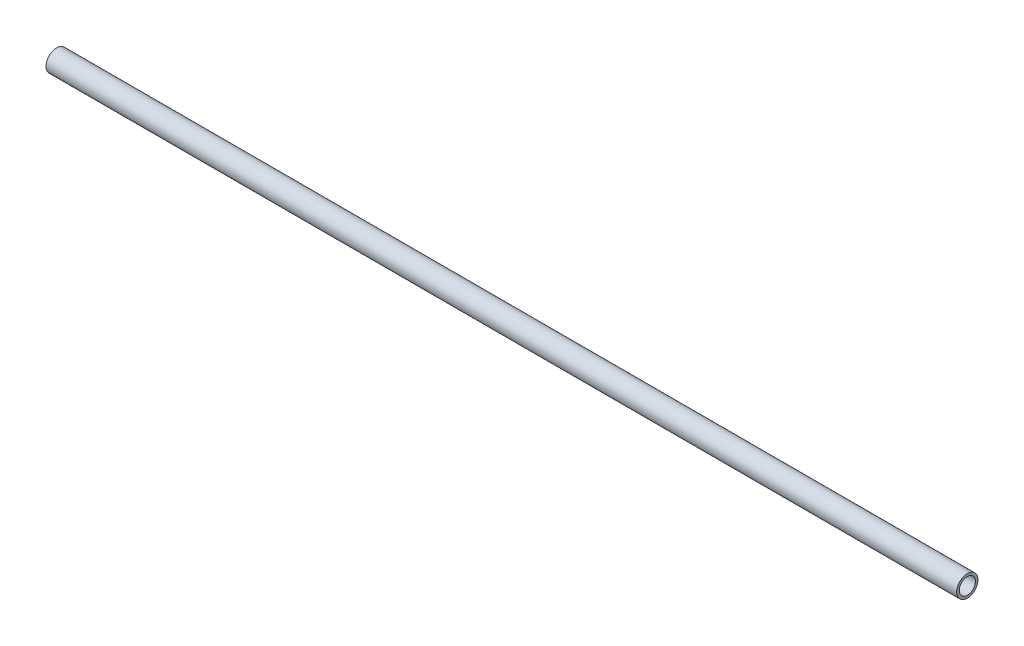
ISO-10303-21;
HEADER;
FILE_DESCRIPTION(('STEP AP214'),'2;1');
FILE_NAME('part.step','',(''),(''),'','','');
FILE_SCHEMA(('AUTOMOTIVE_DESIGN { 1 0 10303 214 1 1 1 1 }'));
ENDSEC;
DATA;
#1=APPLICATION_CONTEXT('core data for automotive mechanical design processes');
#2=APPLICATION_PROTOCOL_DEFINITION('international standard','automotive_design',2000,#1);
#3=PRODUCT_CONTEXT('',#1,'mechanical');
#4=PRODUCT('Part','Part','',(#3));
#5=PRODUCT_RELATED_PRODUCT_CATEGORY('part','',(#4));
#6=PRODUCT_DEFINITION_FORMATION('','',#4);
#7=PRODUCT_DEFINITION_CONTEXT('part definition',#1,'design');
#8=PRODUCT_DEFINITION('design','',#6,#7);
#9=PRODUCT_DEFINITION_SHAPE('','',#8);
#10=(LENGTH_UNIT() NAMED_UNIT(*) SI_UNIT(.MILLI.,.METRE.));
#11=(NAMED_UNIT(*) PLANE_ANGLE_UNIT() SI_UNIT($,.RADIAN.));
#12=(NAMED_UNIT(*) SI_UNIT($,.STERADIAN.) SOLID_ANGLE_UNIT());
#13=UNCERTAINTY_MEASURE_WITH_UNIT(LENGTH_MEASURE(1.E-05),#10,'distance_accuracy_value','');
#14=(GEOMETRIC_REPRESENTATION_CONTEXT(3) GLOBAL_UNCERTAINTY_ASSIGNED_CONTEXT((#13)) GLOBAL_UNIT_ASSIGNED_CONTEXT((#10,
#11,#12)) REPRESENTATION_CONTEXT('',''));
#15=CARTESIAN_POINT('',(0.,0.,0.));
#16=DIRECTION('',(0.,0.,1.));
#17=DIRECTION('',(1.,0.,0.));
#18=AXIS2_PLACEMENT_3D('',#15,#16,#17);
#19=CARTESIAN_POINT('',(90.,0.,0.));
#20=DIRECTION('',(1.,0.,0.));
#21=DIRECTION('',(0.,0.,-1.));
#22=AXIS2_PLACEMENT_3D('',#19,#20,#21);
#23=PLANE('',#22);
#24=CARTESIAN_POINT('',(90.,0.,0.));
#25=DIRECTION('',(1.,0.,0.));
#26=DIRECTION('',(0.,0.,-1.));
#27=AXIS2_PLACEMENT_3D('',#24,#25,#26);
#28=CIRCLE('',#27,1.0541);
#29=CARTESIAN_POINT('',(90.,0.,-1.0541));
#30=VERTEX_POINT('',#29);
#31=EDGE_CURVE('E10',#30,#30,#28,.T.);
#32=ORIENTED_EDGE('',*,*,#31,.T.);
#33=EDGE_LOOP('',(#32));
#34=FACE_BOUND('',#33,.T.);
#35=CARTESIAN_POINT('',(90.,0.,0.));
#36=DIRECTION('',(1.,0.,0.));
#37=DIRECTION('',(0.,0.,-1.));
#38=AXIS2_PLACEMENT_3D('',#35,#36,#37);
#39=CIRCLE('',#38,0.8001);
#40=CARTESIAN_POINT('',(90.,0.,-0.8001));
#41=VERTEX_POINT('',#40);
#42=EDGE_CURVE('E48',#41,#41,#39,.T.);
#43=ORIENTED_EDGE('',*,*,#42,.F.);
#44=EDGE_LOOP('',(#43));
#45=FACE_BOUND('',#44,.T.);
#46=ADVANCED_FACE('F30',(#34,#45),#23,.T.);
#47=CARTESIAN_POINT('',(0.,0.,0.));
#48=DIRECTION('',(1.,0.,0.));
#49=DIRECTION('',(0.,0.,-1.));
#50=AXIS2_PLACEMENT_3D('',#47,#48,#49);
#51=PLANE('',#50);
#52=CARTESIAN_POINT('',(0.,0.,0.));
#53=DIRECTION('',(1.,0.,0.));
#54=DIRECTION('',(0.,0.,-1.));
#55=AXIS2_PLACEMENT_3D('',#52,#53,#54);
#56=CIRCLE('',#55,1.0541);
#57=CARTESIAN_POINT('',(0.,0.,-1.0541));
#58=VERTEX_POINT('',#57);
#59=EDGE_CURVE('E43',#58,#58,#56,.T.);
#60=ORIENTED_EDGE('',*,*,#59,.F.);
#61=EDGE_LOOP('',(#60));
#62=FACE_BOUND('',#61,.T.);
#63=CARTESIAN_POINT('',(0.,0.,0.));
#64=DIRECTION('',(1.,0.,0.));
#65=DIRECTION('',(0.,0.,-1.));
#66=AXIS2_PLACEMENT_3D('',#63,#64,#65);
#67=CIRCLE('',#66,0.8001);
#68=CARTESIAN_POINT('',(0.,0.,-0.8001));
#69=VERTEX_POINT('',#68);
#70=EDGE_CURVE('E50',#69,#69,#67,.T.);
#71=ORIENTED_EDGE('',*,*,#70,.T.);
#72=EDGE_LOOP('',(#71));
#73=FACE_BOUND('',#72,.T.);
#74=ADVANCED_FACE('F70',(#62,#73),#51,.F.);
#75=CARTESIAN_POINT('',(90.,0.,0.));
#76=DIRECTION('',(-1.,0.,0.));
#77=DIRECTION('',(0.,0.,1.));
#78=AXIS2_PLACEMENT_3D('',#75,#76,#77);
#79=CYLINDRICAL_SURFACE('',#78,1.0541);
#80=CARTESIAN_POINT('',(1.19548603606049,0.,-1.0541));
#81=CARTESIAN_POINT('',(1.19548683350998,0.0214873132577128,-1.05410059922096));
#82=CARTESIAN_POINT('',(1.19373556685014,0.0429691878740783,-1.05343728470627));
#83=CARTESIAN_POINT('',(1.18680539809992,0.0852906058644149,-1.0508575295686));
#84=CARTESIAN_POINT('',(1.18162702005604,0.106130246933803,-1.0489412805349));
#85=CARTESIAN_POINT('',(1.16805195915469,0.146550710064765,-1.04406124533073));
#86=CARTESIAN_POINT('',(1.15966151484847,0.166133886908411,-1.04109949062943));
#87=CARTESIAN_POINT('',(1.13993235872664,0.203613209330285,-1.03442317249509));
#88=CARTESIAN_POINT('',(1.12859284945649,0.221508896809493,-1.03070840550057));
#89=CARTESIAN_POINT('',(1.10278109518091,0.255870540523951,-1.02273177523714));
#90=CARTESIAN_POINT('',(1.08820494208702,0.272254794751537,-1.01845434276258));
#91=CARTESIAN_POINT('',(1.05655424951036,0.302412209190713,-1.00991078090395));
#92=CARTESIAN_POINT('',(1.0394789392302,0.316184560812184,-1.00564465542199));
#93=CARTESIAN_POINT('',(1.00251388422606,0.341248882962259,-0.997425185032987));
#94=CARTESIAN_POINT('',(0.98254115052807,0.352425078959103,-0.993490181339056));
#95=CARTESIAN_POINT('',(0.940828079138898,0.371223381653382,-0.986620963371524));
#96=CARTESIAN_POINT('',(0.919088458089556,0.378846920927851,-0.983686345829553));
#97=CARTESIAN_POINT('',(0.87539946287395,0.390000371303013,-0.979316739335641));
#98=CARTESIAN_POINT('',(0.853495801985764,0.393686293022708,-0.977824840445339));
#99=CARTESIAN_POINT('',(0.809333950474418,0.39734764756466,-0.976343154561536));
#100=CARTESIAN_POINT('',(0.787075911663468,0.397324628655782,-0.976352740784527));
#101=CARTESIAN_POINT('',(0.744268727735889,0.393687989234756,-0.977823906780324));
#102=CARTESIAN_POINT('',(0.72369757255266,0.390291347863432,-0.979197741939356));
#103=CARTESIAN_POINT('',(0.683442148644931,0.380362765482785,-0.983096700453968));
#104=CARTESIAN_POINT('',(0.663758015078646,0.373830348420854,-0.985621998614085));
#105=CARTESIAN_POINT('',(0.625395071706544,0.357697315584626,-0.991591830452297));
#106=CARTESIAN_POINT('',(0.60674249437572,0.348040721471337,-0.995052929873888));
#107=CARTESIAN_POINT('',(0.571259760845756,0.325972488962366,-1.00249892977364));
#108=CARTESIAN_POINT('',(0.554430240442612,0.313559893977187,-1.00648401192637));
#109=CARTESIAN_POINT('',(0.521871098084328,0.28534129028141,-1.0148584837282));
#110=CARTESIAN_POINT('',(0.506293384007206,0.269362280918166,-1.01925696776077));
#111=CARTESIAN_POINT('',(0.477993364912762,0.234968317088606,-1.02773054754358));
#112=CARTESIAN_POINT('',(0.465271505838318,0.21655298290176,-1.03180559272459));
#113=CARTESIAN_POINT('',(0.442874967186725,0.177419091514214,-1.039255324435));
#114=CARTESIAN_POINT('',(0.433251264509508,0.156668912722352,-1.04261801078657));
#115=CARTESIAN_POINT('',(0.417681771385797,0.113685923402316,-1.04817502144334));
#116=CARTESIAN_POINT('',(0.411734333695088,0.0914537818596615,-1.05036986896703));
#117=CARTESIAN_POINT('',(0.403979127517383,0.0474161300354827,-1.05325173157938));
#118=CARTESIAN_POINT('',(0.401966823466897,0.0256514770428923,-1.05401316486491));
#119=CARTESIAN_POINT('',(0.401542948883743,-0.0179153407447024,-1.05417264107303));
#120=CARTESIAN_POINT('',(0.403130572377248,-0.0397174960514261,-1.0535709891715));
#121=CARTESIAN_POINT('',(0.409706318183051,-0.0818540259063073,-1.05112097173499));
#122=CARTESIAN_POINT('',(0.414560116657531,-0.102212528866507,-1.04932188238861));
#123=CARTESIAN_POINT('',(0.427353220899096,-0.141811605267963,-1.04470759736797));
#124=CARTESIAN_POINT('',(0.435292927859733,-0.161052032976188,-1.04189226957773));
#125=CARTESIAN_POINT('',(0.454286135941844,-0.198504378889133,-1.03542011613677));
#126=CARTESIAN_POINT('',(0.465424506564772,-0.216669275772185,-1.03174093622684));
#127=CARTESIAN_POINT('',(0.490403029331763,-0.250933238816726,-1.02394754424306));
#128=CARTESIAN_POINT('',(0.504244184560695,-0.267031534312416,-1.01983317091644));
#129=CARTESIAN_POINT('',(0.535187896826083,-0.297690438342814,-1.01132343881293));
#130=CARTESIAN_POINT('',(0.552433865744255,-0.31210602527919,-1.00692572130897));
#131=CARTESIAN_POINT('',(0.589186051845251,-0.337867619787844,-0.998577083687899));
#132=CARTESIAN_POINT('',(0.608692480593053,-0.349213339707717,-0.994626205460668));
#133=CARTESIAN_POINT('',(0.649580222622518,-0.368527835938055,-0.98763383097169));
#134=CARTESIAN_POINT('',(0.670969476176822,-0.376481394285118,-0.984596450433534));
#135=CARTESIAN_POINT('',(0.714930142254714,-0.388621137391481,-0.979869217202806));
#136=CARTESIAN_POINT('',(0.737500805997458,-0.392809678551703,-0.978178521739727));
#137=CARTESIAN_POINT('',(0.781610755917801,-0.397089033103752,-0.976448632106283));
#138=CARTESIAN_POINT('',(0.803122309059038,-0.397427398856049,-0.976309678120613));
#139=CARTESIAN_POINT('',(0.845878653930571,-0.394631948028018,-0.977442925507844));
#140=CARTESIAN_POINT('',(0.867123471181011,-0.39149846621911,-0.978714990823825));
#141=CARTESIAN_POINT('',(0.908074057497015,-0.382041587084515,-0.98244361824494));
#142=CARTESIAN_POINT('',(0.927807124211115,-0.375820140723329,-0.984862218967728));
#143=CARTESIAN_POINT('',(0.9659606692682,-0.360454059407338,-0.990589006002164));
#144=CARTESIAN_POINT('',(0.984380813081351,-0.351308682674667,-0.993897418018004));
#145=CARTESIAN_POINT('',(1.02044166117186,-0.329794936335186,-1.00124804028129));
#146=CARTESIAN_POINT('',(1.037990067996,-0.317282062149999,-1.0053197421762));
#147=CARTESIAN_POINT('',(1.07081709575814,-0.28961146780388,-1.01363728638449));
#148=CARTESIAN_POINT('',(1.08609498946489,-0.274452903610721,-1.0178831839384));
#149=CARTESIAN_POINT('',(1.11480006741196,-0.240929807169481,-1.02634984675733));
#150=CARTESIAN_POINT('',(1.12808021143469,-0.222435223154783,-1.03055652016827));
#151=CARTESIAN_POINT('',(1.15134013429311,-0.183328966963333,-1.03822637369879));
#152=CARTESIAN_POINT('',(1.16131961087733,-0.162717101127454,-1.04168948571817));
#153=CARTESIAN_POINT('',(1.17800338180306,-0.118932295858348,-1.04761225890875));
#154=CARTESIAN_POINT('',(1.18453292897225,-0.0956847016615524,-1.05001749616006));
#155=CARTESIAN_POINT('',(1.19327270218023,-0.0482888048604655,-1.05326062878348));
#156=CARTESIAN_POINT('',(1.19548514012698,-0.0241409699691229,-1.05409932677598));
#157=CARTESIAN_POINT('',(1.19548603606049,0.,-1.0541));
#158=B_SPLINE_CURVE_WITH_KNOTS('',3,(#80,#81,#82,#83,#84,#85,#86,#87,#88,#89,#90,#91,#92,#93,
#94,#95,#96,#97,#98,#99,#100,#101,#102,#103,#104,#105,#106,#107,#108,#109,#110,#111,#112,#113,
#114,#115,#116,#117,#118,#119,#120,#121,#122,#123,#124,#125,#126,#127,#128,#129,#130,#131,#132,
#133,#134,#135,#136,#137,#138,#139,#140,#141,#142,#143,#144,#145,#146,#147,#148,#149,#150,#151,
#152,#153,#154,#155,#156,#157),.UNSPECIFIED.,.T.,.F.,(4,2,2,2,2,2,2,2,2,2,2,2,2,2,2,2,2,2,2,2,2,
2,2,2,2,2,2,2,2,2,2,2,2,2,2,2,2,2,4),(0.,0.0643728896050498,0.128735938095627,0.192974608209659,
0.257230667150113,0.323963592286375,0.390717142929251,0.460038174746714,0.529331229238737,
0.595763537364497,0.662168113903804,0.724561432178382,0.786964225588595,0.850553574211321,
0.914165028871741,0.982088816320596,1.05002320272916,1.11902416631253,1.18799418980109,
1.25327261766904,1.31853643204583,1.38126811392733,1.44400795417434,1.50859677240397,
1.57320960720729,1.6416018116001,1.7100004222556,1.77870273589609,1.84736202100985,
1.91157976512513,1.97579131761068,2.03801131950306,2.1002471186565,2.16576418310872,
2.23130218725127,2.30042686125834,2.36955786345651,2.44191780959407,2.51424067174732),.UNSPECIFIED.);
#159=CARTESIAN_POINT('',(1.19548603606049,0.,-1.0541));
#160=VERTEX_POINT('',#159);
#161=EDGE_CURVE('E53',#160,#160,#158,.T.);
#162=ORIENTED_EDGE('',*,*,#161,.T.);
#163=EDGE_LOOP('',(#162));
#164=FACE_BOUND('',#163,.T.);
#165=ORIENTED_EDGE('',*,*,#31,.F.);
#166=EDGE_LOOP('',(#165));
#167=FACE_BOUND('',#166,.T.);
#168=ORIENTED_EDGE('',*,*,#59,.T.);
#169=EDGE_LOOP('',(#168));
#170=FACE_BOUND('',#169,.T.);
#171=ADVANCED_FACE('F32',(#164,#167,#170),#79,.T.);
#172=CARTESIAN_POINT('',(90.,0.,0.));
#173=DIRECTION('',(-1.,0.,0.));
#174=DIRECTION('',(0.,0.,1.));
#175=AXIS2_PLACEMENT_3D('',#172,#173,#174);
#176=CYLINDRICAL_SURFACE('',#175,0.8001);
#177=CARTESIAN_POINT('',(1.19548603606049,0.,-0.800099999999998));
#178=CARTESIAN_POINT('',(1.1954847389089,0.0208843074632006,-0.800098878302277));
#179=CARTESIAN_POINT('',(1.19382788792484,0.0417941036938532,-0.799273512686285));
#180=CARTESIAN_POINT('',(1.1872731678874,0.0829969492482908,-0.796053174870451));
#181=CARTESIAN_POINT('',(1.18236901537595,0.10328872292983,-0.793655159714147));
#182=CARTESIAN_POINT('',(1.16955802937881,0.14259635868248,-0.787540771182475));
#183=CARTESIAN_POINT('',(1.16166280295691,0.161616822680678,-0.783829497621247));
#184=CARTESIAN_POINT('',(1.14315324230213,0.198035553373488,-0.77543000878947));
#185=CARTESIAN_POINT('',(1.13253915066343,0.215433964608994,-0.770741880686962));
#186=CARTESIAN_POINT('',(1.10817051414698,0.249285576246377,-0.760491885104182));
#187=CARTESIAN_POINT('',(1.09426609440474,0.265619983574351,-0.754894527560044));
#188=CARTESIAN_POINT('',(1.06403380145664,0.295834145329411,-0.743574458411218));
#189=CARTESIAN_POINT('',(1.04770412953002,0.309712060978204,-0.737851656477422));
#190=CARTESIAN_POINT('',(1.01159527739858,0.335676363380962,-0.726428000197984));
#191=CARTESIAN_POINT('',(0.991648243075226,0.347546388010082,-0.720761879538331));
#192=CARTESIAN_POINT('',(0.949729469082418,0.36771297701364,-0.710686366007534));
#193=CARTESIAN_POINT('',(0.927759172119451,0.376012064090308,-0.706276086689983));
#194=CARTESIAN_POINT('',(0.883751434198107,0.388266347479981,-0.69961105277091));
#195=CARTESIAN_POINT('',(0.861795630931963,0.392450451986554,-0.697243741734927));
#196=CARTESIAN_POINT('',(0.817376574262937,0.397057774858405,-0.694631539366655));
#197=CARTESIAN_POINT('',(0.794913828987663,0.39748460487784,-0.694384609837881));
#198=CARTESIAN_POINT('',(0.752948765387736,0.39473337149675,-0.695950252305544));
#199=CARTESIAN_POINT('',(0.733408097497944,0.391972041803604,-0.697524783645791));
#200=CARTESIAN_POINT('',(0.695115140744706,0.383643691688717,-0.702139559977481));
#201=CARTESIAN_POINT('',(0.676363098404288,0.378075800900678,-0.705180259642024));
#202=CARTESIAN_POINT('',(0.63964505043468,0.364189658213039,-0.712452287398013));
#203=CARTESIAN_POINT('',(0.621707565140114,0.355810307568738,-0.716709722403195));
#204=CARTESIAN_POINT('',(0.587407757231761,0.336585687251305,-0.725936397147299));
#205=CARTESIAN_POINT('',(0.571046145913144,0.32573931140409,-0.730905955819963));
#206=CARTESIAN_POINT('',(0.538217413881189,0.300312962588879,-0.741745099128563));
#207=CARTESIAN_POINT('',(0.521990887297216,0.285436246843543,-0.747649697306115));
#208=CARTESIAN_POINT('',(0.492163732946014,0.253146531584159,-0.759190915048751));
#209=CARTESIAN_POINT('',(0.478564322368619,0.235732362946379,-0.764827409489317));
#210=CARTESIAN_POINT('',(0.453803245731328,0.197867110393178,-0.77550769481893));
#211=CARTESIAN_POINT('',(0.442778943179882,0.177314578358354,-0.780513362234422));
#212=CARTESIAN_POINT('',(0.424433942112126,0.134335307416397,-0.78904529900021));
#213=CARTESIAN_POINT('',(0.417110346643305,0.111910050573509,-0.792572725162982));
#214=CARTESIAN_POINT('',(0.406968940392027,0.0677925194201716,-0.797506070018502));
#215=CARTESIAN_POINT('',(0.403831089751363,0.0461907581990154,-0.7990621449025));
#216=CARTESIAN_POINT('',(0.401149005188164,0.00271438082740956,-0.8003903639666));
#217=CARTESIAN_POINT('',(0.401603108766197,-0.019160104415304,-0.800163333439228));
#218=CARTESIAN_POINT('',(0.405904407148028,-0.0607937747102967,-0.798038773666118));
#219=CARTESIAN_POINT('',(0.409491061480935,-0.0805873606506713,-0.796269534648231));
#220=CARTESIAN_POINT('',(0.419549405571042,-0.119252785888258,-0.791402961775156));
#221=CARTESIAN_POINT('',(0.426021415665901,-0.138124522581825,-0.788305480457449));
#222=CARTESIAN_POINT('',(0.441840335296068,-0.175041447281268,-0.780951484099315));
#223=CARTESIAN_POINT('',(0.451264969346019,-0.193046951345167,-0.776664042237607));
#224=CARTESIAN_POINT('',(0.472634456496797,-0.227281107288301,-0.76734514282698));
#225=CARTESIAN_POINT('',(0.484580390308689,-0.24350899267695,-0.762313366509646));
#226=CARTESIAN_POINT('',(0.51199155724599,-0.275395882310185,-0.751417186505354));
#227=CARTESIAN_POINT('',(0.527685767734574,-0.290847002616786,-0.745519362498924));
#228=CARTESIAN_POINT('',(0.561461623023949,-0.318988369527675,-0.733920011210673));
#229=CARTESIAN_POINT('',(0.579544842119693,-0.331676780849745,-0.728218616521593));
#230=CARTESIAN_POINT('',(0.618648265108508,-0.354483525399704,-0.717403889515439));
#231=CARTESIAN_POINT('',(0.639765767459942,-0.364455423801059,-0.712330078093198));
#232=CARTESIAN_POINT('',(0.683712275583267,-0.380597106497768,-0.703839673628711));
#233=CARTESIAN_POINT('',(0.706539069108082,-0.38677171318784,-0.700420979838811));
#234=CARTESIAN_POINT('',(0.750923145556714,-0.394580534303144,-0.69604916721545));
#235=CARTESIAN_POINT('',(0.772393558171654,-0.396591957934914,-0.69489181077756));
#236=CARTESIAN_POINT('',(0.815386051432934,-0.397101876507407,-0.694600951683868));
#237=CARTESIAN_POINT('',(0.836908107199349,-0.395601815811519,-0.695466616907227));
#238=CARTESIAN_POINT('',(0.877298301382834,-0.389482559401414,-0.698908825546444));
#239=CARTESIAN_POINT('',(0.896227918976735,-0.385164360028771,-0.7013199033821));
#240=CARTESIAN_POINT('',(0.933074747779585,-0.373899313342452,-0.707389569732533));
#241=CARTESIAN_POINT('',(0.950991635133735,-0.366951630567373,-0.71104855470621));
#242=CARTESIAN_POINT('',(0.986636764152811,-0.350100852713656,-0.719502424006834));
#243=CARTESIAN_POINT('',(1.00427130388343,-0.340030438944963,-0.724357145927179));
#244=CARTESIAN_POINT('',(1.03771482294223,-0.317407009445835,-0.734552049803622));
#245=CARTESIAN_POINT('',(1.05352285448655,-0.304852713899999,-0.739892481250974));
#246=CARTESIAN_POINT('',(1.08481806848609,-0.275866788236498,-0.751217127569031));
#247=CARTESIAN_POINT('',(1.1000437079739,-0.259151644875662,-0.75720240290796));
#248=CARTESIAN_POINT('',(1.12753058959251,-0.22323319545763,-0.768558032514935));
#249=CARTESIAN_POINT('',(1.13979026313649,-0.204028581023015,-0.773928060615241));
#250=CARTESIAN_POINT('',(1.16099098204733,-0.163454163141734,-0.783504597291233));
#251=CARTESIAN_POINT('',(1.16991389918967,-0.142073312746084,-0.787704719313361));
#252=CARTESIAN_POINT('',(1.18392252297082,-0.0978721040908158,-0.794403449186936));
#253=CARTESIAN_POINT('',(1.18901920271636,-0.0750560672837852,-0.796906920767648));
#254=CARTESIAN_POINT('',(1.19320823427011,-0.0433425574794751,-0.79897222736102));
#255=CARTESIAN_POINT('',(1.19406123945723,-0.0347030857826993,-0.799394073028049));
#256=CARTESIAN_POINT('',(1.19520041802504,-0.0173772149018826,-0.799958196573761));
#257=CARTESIAN_POINT('',(1.19548657585832,-0.0086908144372395,-0.800100466784294));
#258=CARTESIAN_POINT('',(1.19548603606049,0.,-0.800099999999998));
#259=B_SPLINE_CURVE_WITH_KNOTS('',3,(#177,#178,#179,#180,#181,#182,#183,#184,#185,#186,#187,
#188,#189,#190,#191,#192,#193,#194,#195,#196,#197,#198,#199,#200,#201,#202,#203,#204,#205,#206,
#207,#208,#209,#210,#211,#212,#213,#214,#215,#216,#217,#218,#219,#220,#221,#222,#223,#224,#225,
#226,#227,#228,#229,#230,#231,#232,#233,#234,#235,#236,#237,#238,#239,#240,#241,#242,#243,#244,
#245,#246,#247,#248,#249,#250,#251,#252,#253,#254,#255,#256,#257,#258),.UNSPECIFIED.,.T.,.F.,(4,
2,2,2,2,2,2,2,2,2,2,2,2,2,2,2,2,2,2,2,2,2,2,2,2,2,2,2,2,2,2,2,2,2,2,2,2,2,2,2,4),(0.,
0.0626176295565204,0.125356778330605,0.187854916859319,0.250347480853898,0.316578175009097,
0.382858237637996,0.454176385049073,0.525444066434687,0.59247498241099,0.659441458337861,
0.718557493987234,0.777691873897831,0.838204988989687,0.898745290856977,0.966824705683673,
1.03493558766523,1.10611380645007,1.17723621952066,1.2425306968411,1.30779495504653,
1.36809832590934,1.42840839343443,1.49046251703715,1.55254329327001,1.62064614351369,
1.68879409773805,1.76010167201966,1.83131850077499,1.89573590848664,1.96012682432563,
2.01856837771929,2.07702851526054,2.13941976561787,2.20184324706229,2.27168754235094,
2.34156869528238,2.41182417141016,2.48187738691142,2.50793442875366,2.53399218527416),.UNSPECIFIED.);
#260=CARTESIAN_POINT('',(1.19548603606049,0.,-0.800099999999998));
#261=VERTEX_POINT('',#260);
#262=EDGE_CURVE('E35',#261,#261,#259,.T.);
#263=ORIENTED_EDGE('',*,*,#262,.F.);
#264=EDGE_LOOP('',(#263));
#265=FACE_BOUND('',#264,.T.);
#266=ORIENTED_EDGE('',*,*,#42,.T.);
#267=EDGE_LOOP('',(#266));
#268=FACE_BOUND('',#267,.T.);
#269=ORIENTED_EDGE('',*,*,#70,.F.);
#270=EDGE_LOOP('',(#269));
#271=FACE_BOUND('',#270,.T.);
#272=ADVANCED_FACE('F62',(#265,#268,#271),#176,.F.);
#273=CARTESIAN_POINT('',(0.798611036060493,0.,-10.));
#274=DIRECTION('',(0.,0.,1.));
#275=DIRECTION('',(1.,0.,0.));
#276=AXIS2_PLACEMENT_3D('',#273,#274,#275);
#277=CYLINDRICAL_SURFACE('',#276,0.396875);
#278=ORIENTED_EDGE('',*,*,#262,.T.);
#279=EDGE_LOOP('',(#278));
#280=FACE_BOUND('',#279,.T.);
#281=ORIENTED_EDGE('',*,*,#161,.F.);
#282=EDGE_LOOP('',(#281));
#283=FACE_BOUND('',#282,.T.);
#284=ADVANCED_FACE('F59',(#280,#283),#277,.F.);
#285=CLOSED_SHELL('',(#46,#74,#171,#272,#284));
#286=MANIFOLD_SOLID_BREP('B2',#285);
#287=ADVANCED_BREP_SHAPE_REPRESENTATION('',(#18,#286),#14);
#288=SHAPE_DEFINITION_REPRESENTATION(#9,#287);
ENDSEC;
END-ISO-10303-21;
